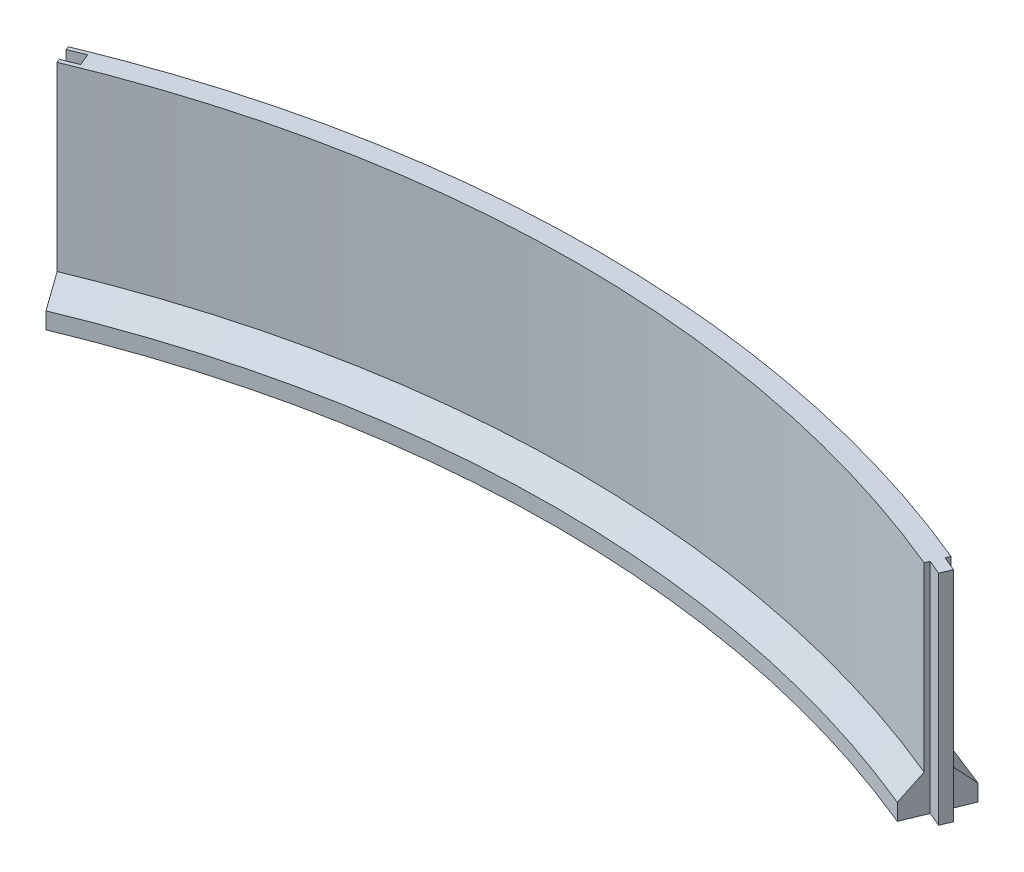
ISO-10303-21;
HEADER;
FILE_DESCRIPTION(('STEP AP214'),'2;1');
FILE_NAME('part.step','',(''),(''),'','','');
FILE_SCHEMA(('AUTOMOTIVE_DESIGN { 1 0 10303 214 1 1 1 1 }'));
ENDSEC;
DATA;
#1=APPLICATION_CONTEXT('core data for automotive mechanical design processes');
#2=APPLICATION_PROTOCOL_DEFINITION('international standard','automotive_design',2000,#1);
#3=PRODUCT_CONTEXT('',#1,'mechanical');
#4=PRODUCT('Part','Part','',(#3));
#5=PRODUCT_RELATED_PRODUCT_CATEGORY('part','',(#4));
#6=PRODUCT_DEFINITION_FORMATION('','',#4);
#7=PRODUCT_DEFINITION_CONTEXT('part definition',#1,'design');
#8=PRODUCT_DEFINITION('design','',#6,#7);
#9=PRODUCT_DEFINITION_SHAPE('','',#8);
#10=(LENGTH_UNIT() NAMED_UNIT(*) SI_UNIT(.MILLI.,.METRE.));
#11=(NAMED_UNIT(*) PLANE_ANGLE_UNIT() SI_UNIT($,.RADIAN.));
#12=(NAMED_UNIT(*) SI_UNIT($,.STERADIAN.) SOLID_ANGLE_UNIT());
#13=UNCERTAINTY_MEASURE_WITH_UNIT(LENGTH_MEASURE(1.E-05),#10,'distance_accuracy_value','');
#14=(GEOMETRIC_REPRESENTATION_CONTEXT(3) GLOBAL_UNCERTAINTY_ASSIGNED_CONTEXT((#13)) GLOBAL_UNIT_ASSIGNED_CONTEXT((#10,
#11,#12)) REPRESENTATION_CONTEXT('',''));
#15=CARTESIAN_POINT('',(0.,0.,0.));
#16=DIRECTION('',(0.,0.,1.));
#17=DIRECTION('',(1.,0.,0.));
#18=AXIS2_PLACEMENT_3D('',#15,#16,#17);
#19=CARTESIAN_POINT('',(0.,13.25,0.));
#20=DIRECTION('',(0.,-1.,0.));
#21=DIRECTION('',(0.,0.,-1.));
#22=AXIS2_PLACEMENT_3D('',#19,#20,#21);
#23=CYLINDRICAL_SURFACE('',#22,137.5);
#24=DIRECTION('',(0.,-1.,0.));
#25=VECTOR('',#24,1.);
#26=CARTESIAN_POINT('',(-52.6189719501999,13.25,-127.033435720302));
#27=LINE('',#26,#25);
#28=CARTESIAN_POINT('',(-52.6189719501999,13.25,-127.033435720302));
#29=VERTEX_POINT('',#28);
#30=CARTESIAN_POINT('',(-52.6189719501999,-8.75000000000001,-127.033435720302));
#31=VERTEX_POINT('',#30);
#32=EDGE_CURVE('E219',#29,#31,#27,.T.);
#33=ORIENTED_EDGE('',*,*,#32,.T.);
#34=CARTESIAN_POINT('',(0.,-8.75000000000001,0.));
#35=DIRECTION('',(0.,-1.,0.));
#36=DIRECTION('',(0.,0.,-1.));
#37=AXIS2_PLACEMENT_3D('',#34,#35,#36);
#38=CIRCLE('',#37,137.5);
#39=CARTESIAN_POINT('',(52.6189719502,-8.75000000000001,-127.033435720302));
#40=VERTEX_POINT('',#39);
#41=EDGE_CURVE('E157',#31,#40,#38,.T.);
#42=ORIENTED_EDGE('',*,*,#41,.T.);
#43=DIRECTION('',(0.,-1.,0.));
#44=VECTOR('',#43,1.);
#45=CARTESIAN_POINT('',(52.6189719502,13.25,-127.033435720302));
#46=LINE('',#45,#44);
#47=CARTESIAN_POINT('',(52.6189719502,13.25,-127.033435720302));
#48=VERTEX_POINT('',#47);
#49=EDGE_CURVE('E267',#48,#40,#46,.T.);
#50=ORIENTED_EDGE('',*,*,#49,.F.);
#51=CARTESIAN_POINT('',(0.,13.25,0.));
#52=DIRECTION('',(0.,-1.,0.));
#53=DIRECTION('',(0.,0.,1.));
#54=AXIS2_PLACEMENT_3D('',#51,#52,#53);
#55=CIRCLE('',#54,137.5);
#56=EDGE_CURVE('E194',#29,#48,#55,.T.);
#57=ORIENTED_EDGE('',*,*,#56,.F.);
#58=EDGE_LOOP('',(#33,#42,#50,#57));
#59=FACE_BOUND('',#58,.T.);
#60=ADVANCED_FACE('F37',(#59),#23,.F.);
#61=CARTESIAN_POINT('',(0.,13.25,0.));
#62=DIRECTION('',(0.,-1.,0.));
#63=DIRECTION('',(0.,0.,-1.));
#64=AXIS2_PLACEMENT_3D('',#61,#62,#63);
#65=CYLINDRICAL_SURFACE('',#64,140.);
#66=DIRECTION('',(0.,-1.,0.));
#67=VECTOR('',#66,1.);
#68=CARTESIAN_POINT('',(53.5756805311127,13.25,-129.34313455158));
#69=LINE('',#68,#67);
#70=CARTESIAN_POINT('',(53.5756805311127,13.25,-129.34313455158));
#71=VERTEX_POINT('',#70);
#72=CARTESIAN_POINT('',(53.5756805311127,-8.74999999999999,-129.34313455158));
#73=VERTEX_POINT('',#72);
#74=EDGE_CURVE('E257',#71,#73,#69,.T.);
#75=ORIENTED_EDGE('',*,*,#74,.T.);
#76=CARTESIAN_POINT('',(0.,-8.74999999999999,0.));
#77=DIRECTION('',(0.,-1.,0.));
#78=DIRECTION('',(0.,0.,-1.));
#79=AXIS2_PLACEMENT_3D('',#76,#77,#78);
#80=CIRCLE('',#79,140.);
#81=CARTESIAN_POINT('',(-53.5756805311127,-8.74999999999999,-129.34313455158));
#82=VERTEX_POINT('',#81);
#83=EDGE_CURVE('E59',#73,#82,#80,.F.);
#84=ORIENTED_EDGE('',*,*,#83,.T.);
#85=DIRECTION('',(0.,-1.,0.));
#86=VECTOR('',#85,1.);
#87=CARTESIAN_POINT('',(-53.5756805311127,13.25,-129.34313455158));
#88=LINE('',#87,#86);
#89=CARTESIAN_POINT('',(-53.5756805311127,13.25,-129.34313455158));
#90=VERTEX_POINT('',#89);
#91=EDGE_CURVE('E255',#90,#82,#88,.T.);
#92=ORIENTED_EDGE('',*,*,#91,.F.);
#93=CARTESIAN_POINT('',(0.,13.25,0.));
#94=DIRECTION('',(0.,1.,0.));
#95=DIRECTION('',(0.,0.,1.));
#96=AXIS2_PLACEMENT_3D('',#93,#94,#95);
#97=CIRCLE('',#96,140.);
#98=EDGE_CURVE('E207',#71,#90,#97,.T.);
#99=ORIENTED_EDGE('',*,*,#98,.F.);
#100=EDGE_LOOP('',(#75,#84,#92,#99));
#101=FACE_BOUND('',#100,.T.);
#102=ADVANCED_FACE('F312',(#101),#65,.T.);
#103=CARTESIAN_POINT('',(52.8338439991729,13.25,-127.552182735107));
#104=DIRECTION('',(-0.923879532510857,0.,-0.382683432366128));
#105=DIRECTION('',(-0.382683432366128,0.,0.923879532510857));
#106=AXIS2_PLACEMENT_3D('',#103,#104,#105);
#107=PLANE('',#106);
#108=DIRECTION('',(0.382683432366128,0.,-0.923879532510857));
#109=VECTOR('',#108,1.);
#110=CARTESIAN_POINT('',(52.8338439991729,-13.25,-127.552182735107));
#111=LINE('',#110,#109);
#112=CARTESIAN_POINT('',(51.6622633692874,-13.25,-124.723736889024));
#113=VERTEX_POINT('',#112);
#114=CARTESIAN_POINT('',(52.8338439991729,-13.25,-127.552182735107));
#115=VERTEX_POINT('',#114);
#116=EDGE_CURVE('E188',#113,#115,#111,.T.);
#117=ORIENTED_EDGE('',*,*,#116,.T.);
#118=DIRECTION('',(0.,-1.,0.));
#119=VECTOR('',#118,1.);
#120=CARTESIAN_POINT('',(52.8338439991729,13.25,-127.552182735107));
#121=LINE('',#120,#119);
#122=CARTESIAN_POINT('',(52.8338439991729,13.25,-127.552182735107));
#123=VERTEX_POINT('',#122);
#124=EDGE_CURVE('E265',#123,#115,#121,.T.);
#125=ORIENTED_EDGE('',*,*,#124,.F.);
#126=DIRECTION('',(0.382683432365087,0.,-0.923879532511288));
#127=VECTOR('',#126,1.);
#128=CARTESIAN_POINT('',(52.7955756559363,13.25,-127.459794781856));
#129=LINE('',#128,#127);
#130=EDGE_CURVE('E197',#48,#123,#129,.T.);
#131=ORIENTED_EDGE('',*,*,#130,.F.);
#132=ORIENTED_EDGE('',*,*,#49,.T.);
#133=DIRECTION('',(-0.270598050073833,-0.707106781186546,0.653281482437886));
#134=VECTOR('',#133,1.);
#135=CARTESIAN_POINT('',(-1.43125334104137E-10,-146.249999999999,-5.92844545053024E-11));
#136=LINE('',#135,#134);
#137=CARTESIAN_POINT('',(51.6622633692874,-11.25,-124.723736889024));
#138=VERTEX_POINT('',#137);
#139=EDGE_CURVE('E161',#40,#138,#136,.T.);
#140=ORIENTED_EDGE('',*,*,#139,.T.);
#141=DIRECTION('',(0.,-1.,0.));
#142=VECTOR('',#141,1.);
#143=CARTESIAN_POINT('',(51.6622633692874,-11.25,-124.723736889024));
#144=LINE('',#143,#142);
#145=EDGE_CURVE('E177',#138,#113,#144,.T.);
#146=ORIENTED_EDGE('',*,*,#145,.T.);
#147=EDGE_LOOP('',(#117,#125,#131,#132,#140,#146));
#148=FACE_BOUND('',#147,.T.);
#149=ADVANCED_FACE('F273',(#148),#107,.F.);
#150=CARTESIAN_POINT('',(54.5892151109444,13.25,-126.825084213613));
#151=DIRECTION('',(0.382683432365083,0.,-0.92387953251129));
#152=DIRECTION('',(-0.92387953251129,0.,-0.382683432365083));
#153=AXIS2_PLACEMENT_3D('',#150,#151,#152);
#154=PLANE('',#153);
#155=DIRECTION('',(0.92387953251129,0.,0.382683432365083));
#156=VECTOR('',#155,1.);
#157=CARTESIAN_POINT('',(54.5892151109444,-13.25,-126.825084213613));
#158=LINE('',#157,#156);
#159=CARTESIAN_POINT('',(54.5892151109444,-13.25,-126.825084213613));
#160=VERTEX_POINT('',#159);
#161=EDGE_CURVE('E222',#115,#160,#158,.T.);
#162=ORIENTED_EDGE('',*,*,#161,.T.);
#163=DIRECTION('',(0.,-1.,0.));
#164=VECTOR('',#163,1.);
#165=CARTESIAN_POINT('',(54.5892151109444,13.25,-126.825084213613));
#166=LINE('',#165,#164);
#167=CARTESIAN_POINT('',(54.5892151109444,13.25,-126.825084213613));
#168=VERTEX_POINT('',#167);
#169=EDGE_CURVE('E263',#168,#160,#166,.T.);
#170=ORIENTED_EDGE('',*,*,#169,.F.);
#171=DIRECTION('',(0.92387953251129,0.,0.382683432365083));
#172=VECTOR('',#171,1.);
#173=CARTESIAN_POINT('',(54.5892151109444,13.25,-126.825084213613));
#174=LINE('',#173,#172);
#175=EDGE_CURVE('E199',#123,#168,#174,.T.);
#176=ORIENTED_EDGE('',*,*,#175,.F.);
#177=ORIENTED_EDGE('',*,*,#124,.T.);
#178=EDGE_LOOP('',(#162,#170,#176,#177));
#179=FACE_BOUND('',#178,.T.);
#180=ADVANCED_FACE('F296',(#179),#154,.F.);
#181=CARTESIAN_POINT('',(55.1161795939115,13.25,-128.097289015281));
#182=DIRECTION('',(-0.923879532511286,0.,-0.382683432365091));
#183=DIRECTION('',(-0.382683432365091,0.,0.923879532511286));
#184=AXIS2_PLACEMENT_3D('',#181,#182,#183);
#185=PLANE('',#184);
#186=DIRECTION('',(0.382683432365091,0.,-0.923879532511286));
#187=VECTOR('',#186,1.);
#188=CARTESIAN_POINT('',(55.1161795939115,-13.25,-128.097289015281));
#189=LINE('',#188,#187);
#190=CARTESIAN_POINT('',(55.1161795939115,-13.25,-128.097289015281));
#191=VERTEX_POINT('',#190);
#192=EDGE_CURVE('E225',#160,#191,#189,.T.);
#193=ORIENTED_EDGE('',*,*,#192,.T.);
#194=DIRECTION('',(0.,-1.,0.));
#195=VECTOR('',#194,1.);
#196=CARTESIAN_POINT('',(55.1161795939115,13.25,-128.097289015281));
#197=LINE('',#196,#195);
#198=CARTESIAN_POINT('',(55.1161795939115,13.25,-128.097289015281));
#199=VERTEX_POINT('',#198);
#200=EDGE_CURVE('E261',#199,#191,#197,.T.);
#201=ORIENTED_EDGE('',*,*,#200,.F.);
#202=DIRECTION('',(0.382683432365091,0.,-0.923879532511286));
#203=VECTOR('',#202,1.);
#204=CARTESIAN_POINT('',(55.1161795939115,13.25,-128.097289015281));
#205=LINE('',#204,#203);
#206=EDGE_CURVE('E201',#168,#199,#205,.T.);
#207=ORIENTED_EDGE('',*,*,#206,.F.);
#208=ORIENTED_EDGE('',*,*,#169,.T.);
#209=EDGE_LOOP('',(#193,#201,#207,#208));
#210=FACE_BOUND('',#209,.T.);
#211=ADVANCED_FACE('F302',(#210),#185,.F.);
#212=CARTESIAN_POINT('',(53.36080848214,13.25,-128.824387536775));
#213=DIRECTION('',(-0.382683432365093,0.,0.923879532511286));
#214=DIRECTION('',(0.923879532511286,0.,0.382683432365093));
#215=AXIS2_PLACEMENT_3D('',#212,#213,#214);
#216=PLANE('',#215);
#217=DIRECTION('',(-0.923879532511286,0.,-0.382683432365092));
#218=VECTOR('',#217,1.);
#219=CARTESIAN_POINT('',(53.36080848214,-13.25,-128.824387536775));
#220=LINE('',#219,#218);
#221=CARTESIAN_POINT('',(53.36080848214,-13.25,-128.824387536775));
#222=VERTEX_POINT('',#221);
#223=EDGE_CURVE('E228',#191,#222,#220,.T.);
#224=ORIENTED_EDGE('',*,*,#223,.T.);
#225=DIRECTION('',(0.,-1.,0.));
#226=VECTOR('',#225,1.);
#227=CARTESIAN_POINT('',(53.36080848214,13.25,-128.824387536775));
#228=LINE('',#227,#226);
#229=CARTESIAN_POINT('',(53.36080848214,13.25,-128.824387536775));
#230=VERTEX_POINT('',#229);
#231=EDGE_CURVE('E259',#230,#222,#228,.T.);
#232=ORIENTED_EDGE('',*,*,#231,.F.);
#233=DIRECTION('',(-0.923879532511286,0.,-0.382683432365092));
#234=VECTOR('',#233,1.);
#235=CARTESIAN_POINT('',(53.36080848214,13.25,-128.824387536775));
#236=LINE('',#235,#234);
#237=EDGE_CURVE('E203',#199,#230,#236,.T.);
#238=ORIENTED_EDGE('',*,*,#237,.F.);
#239=ORIENTED_EDGE('',*,*,#200,.T.);
#240=EDGE_LOOP('',(#224,#232,#238,#239));
#241=FACE_BOUND('',#240,.T.);
#242=ADVANCED_FACE('F305',(#241),#216,.F.);
#243=CARTESIAN_POINT('',(53.5756805311127,13.25,-129.34313455158));
#244=DIRECTION('',(-0.923879532511279,0.,-0.382683432365109));
#245=DIRECTION('',(-0.382683432365109,0.,0.923879532511279));
#246=AXIS2_PLACEMENT_3D('',#243,#244,#245);
#247=PLANE('',#246);
#248=DIRECTION('',(0.382683432365109,0.,-0.923879532511279));
#249=VECTOR('',#248,1.);
#250=CARTESIAN_POINT('',(53.5756805311127,-13.25,-129.34313455158));
#251=LINE('',#250,#249);
#252=CARTESIAN_POINT('',(54.5323891120193,-13.25,-131.652833382858));
#253=VERTEX_POINT('',#252);
#254=EDGE_CURVE('E231',#222,#253,#251,.T.);
#255=ORIENTED_EDGE('',*,*,#254,.T.);
#256=DIRECTION('',(0.,-1.,0.));
#257=VECTOR('',#256,1.);
#258=CARTESIAN_POINT('',(54.5323891120193,-11.25,-131.652833382858));
#259=LINE('',#258,#257);
#260=CARTESIAN_POINT('',(54.5323891120193,-11.25,-131.652833382858));
#261=VERTEX_POINT('',#260);
#262=EDGE_CURVE('E189',#261,#253,#259,.T.);
#263=ORIENTED_EDGE('',*,*,#262,.F.);
#264=DIRECTION('',(0.270598050073111,-0.70710678118655,-0.653281482438181));
#265=VECTOR('',#264,1.);
#266=CARTESIAN_POINT('',(-2.53863801421052E-12,131.250000000001,-1.05153829544196E-12));
#267=LINE('',#266,#265);
#268=EDGE_CURVE('E46',#261,#73,#267,.F.);
#269=ORIENTED_EDGE('',*,*,#268,.T.);
#270=ORIENTED_EDGE('',*,*,#74,.F.);
#271=DIRECTION('',(0.382683432364266,0.,-0.923879532511628));
#272=VECTOR('',#271,1.);
#273=CARTESIAN_POINT('',(53.3990768253763,13.25,-128.916775490026));
#274=LINE('',#273,#272);
#275=EDGE_CURVE('E205',#230,#71,#274,.T.);
#276=ORIENTED_EDGE('',*,*,#275,.F.);
#277=ORIENTED_EDGE('',*,*,#231,.T.);
#278=EDGE_LOOP('',(#255,#263,#269,#270,#276,#277));
#279=FACE_BOUND('',#278,.T.);
#280=ADVANCED_FACE('F308',(#279),#247,.F.);
#281=CARTESIAN_POINT('',(-53.3990768253764,13.25,-128.916775490026));
#282=DIRECTION('',(0.923879532511318,0.,-0.382683432365014));
#283=DIRECTION('',(-0.382683432365014,0.,-0.923879532511318));
#284=AXIS2_PLACEMENT_3D('',#281,#282,#283);
#285=PLANE('',#284);
#286=DIRECTION('',(0.382683432365014,0.,0.923879532511318));
#287=VECTOR('',#286,1.);
#288=CARTESIAN_POINT('',(-53.3990768253764,-13.25,-128.916775490026));
#289=LINE('',#288,#287);
#290=CARTESIAN_POINT('',(-54.5323891120215,-13.25,-131.652833382858));
#291=VERTEX_POINT('',#290);
#292=CARTESIAN_POINT('',(-53.3990768253764,-13.25,-128.916775490026));
#293=VERTEX_POINT('',#292);
#294=EDGE_CURVE('E233',#291,#293,#289,.T.);
#295=ORIENTED_EDGE('',*,*,#294,.T.);
#296=DIRECTION('',(0.,-1.,0.));
#297=VECTOR('',#296,1.);
#298=CARTESIAN_POINT('',(-53.3990768253764,13.25,-128.916775490026));
#299=LINE('',#298,#297);
#300=CARTESIAN_POINT('',(-53.3990768253764,13.25,-128.916775490026));
#301=VERTEX_POINT('',#300);
#302=EDGE_CURVE('E253',#301,#293,#299,.T.);
#303=ORIENTED_EDGE('',*,*,#302,.F.);
#304=DIRECTION('',(0.382683432365014,0.,0.923879532511318));
#305=VECTOR('',#304,1.);
#306=CARTESIAN_POINT('',(-53.3990768253764,13.25,-128.916775490026));
#307=LINE('',#306,#305);
#308=EDGE_CURVE('E209',#90,#301,#307,.T.);
#309=ORIENTED_EDGE('',*,*,#308,.F.);
#310=ORIENTED_EDGE('',*,*,#91,.T.);
#311=DIRECTION('',(0.270598050073044,0.70710678118655,0.653281482438209));
#312=VECTOR('',#311,1.);
#313=CARTESIAN_POINT('',(-1.06994617316099E-11,131.250000000001,4.43186215932373E-12));
#314=LINE('',#313,#312);
#315=CARTESIAN_POINT('',(-54.5323891120215,-11.25,-131.652833382858));
#316=VERTEX_POINT('',#315);
#317=EDGE_CURVE('E11',#82,#316,#314,.F.);
#318=ORIENTED_EDGE('',*,*,#317,.T.);
#319=DIRECTION('',(0.,-1.,0.));
#320=VECTOR('',#319,1.);
#321=CARTESIAN_POINT('',(-54.5323891120215,-11.25,-131.652833382858));
#322=LINE('',#321,#320);
#323=EDGE_CURVE('E171',#316,#291,#322,.T.);
#324=ORIENTED_EDGE('',*,*,#323,.T.);
#325=EDGE_LOOP('',(#295,#303,#309,#310,#318,#324));
#326=FACE_BOUND('',#325,.T.);
#327=ADVANCED_FACE('F315',(#326),#285,.F.);
#328=CARTESIAN_POINT('',(-53.3990768253764,13.25,-128.916775490026));
#329=DIRECTION('',(-0.382683432365069,0.,-0.923879532511295));
#330=DIRECTION('',(-0.923879532511295,0.,0.382683432365069));
#331=AXIS2_PLACEMENT_3D('',#328,#329,#330);
#332=PLANE('',#331);
#333=DIRECTION('',(0.923879532511295,0.,-0.382683432365069));
#334=VECTOR('',#333,1.);
#335=CARTESIAN_POINT('',(-53.3990768253764,-13.25,-128.916775490026));
#336=LINE('',#335,#334);
#337=CARTESIAN_POINT('',(-51.5513177603538,-13.25,-129.682142354756));
#338=VERTEX_POINT('',#337);
#339=EDGE_CURVE('E236',#293,#338,#336,.T.);
#340=ORIENTED_EDGE('',*,*,#339,.T.);
#341=DIRECTION('',(0.,-1.,0.));
#342=VECTOR('',#341,1.);
#343=CARTESIAN_POINT('',(-51.5513177603538,13.25,-129.682142354756));
#344=LINE('',#343,#342);
#345=CARTESIAN_POINT('',(-51.5513177603538,13.25,-129.682142354756));
#346=VERTEX_POINT('',#345);
#347=EDGE_CURVE('E251',#346,#338,#344,.T.);
#348=ORIENTED_EDGE('',*,*,#347,.F.);
#349=DIRECTION('',(0.923879532511295,0.,-0.382683432365069));
#350=VECTOR('',#349,1.);
#351=CARTESIAN_POINT('',(-53.3990768253764,13.25,-128.916775490026));
#352=LINE('',#351,#350);
#353=EDGE_CURVE('E211',#301,#346,#352,.T.);
#354=ORIENTED_EDGE('',*,*,#353,.F.);
#355=ORIENTED_EDGE('',*,*,#302,.T.);
#356=EDGE_LOOP('',(#340,#348,#354,#355));
#357=FACE_BOUND('',#356,.T.);
#358=ADVANCED_FACE('F320',(#357),#332,.F.);
#359=CARTESIAN_POINT('',(-51.5513177603538,13.25,-129.682142354756));
#360=DIRECTION('',(0.923879532511284,0.,-0.382683432365097));
#361=DIRECTION('',(-0.382683432365097,0.,-0.923879532511284));
#362=AXIS2_PLACEMENT_3D('',#359,#360,#361);
#363=PLANE('',#362);
#364=DIRECTION('',(0.382683432365097,0.,0.923879532511284));
#365=VECTOR('',#364,1.);
#366=CARTESIAN_POINT('',(-51.5513177603538,-13.25,-129.682142354756));
#367=LINE('',#366,#365);
#368=CARTESIAN_POINT('',(-50.9478165909137,-13.25,-128.225161646586));
#369=VERTEX_POINT('',#368);
#370=EDGE_CURVE('E239',#338,#369,#367,.T.);
#371=ORIENTED_EDGE('',*,*,#370,.T.);
#372=DIRECTION('',(0.,-1.,0.));
#373=VECTOR('',#372,1.);
#374=CARTESIAN_POINT('',(-50.9478165909137,13.25,-128.225161646586));
#375=LINE('',#374,#373);
#376=CARTESIAN_POINT('',(-50.9478165909137,13.25,-128.225161646586));
#377=VERTEX_POINT('',#376);
#378=EDGE_CURVE('E249',#377,#369,#375,.T.);
#379=ORIENTED_EDGE('',*,*,#378,.F.);
#380=DIRECTION('',(0.382683432365097,0.,0.923879532511284));
#381=VECTOR('',#380,1.);
#382=CARTESIAN_POINT('',(-51.5513177603538,13.25,-129.682142354756));
#383=LINE('',#382,#381);
#384=EDGE_CURVE('E213',#346,#377,#383,.T.);
#385=ORIENTED_EDGE('',*,*,#384,.F.);
#386=ORIENTED_EDGE('',*,*,#347,.T.);
#387=EDGE_LOOP('',(#371,#379,#385,#386));
#388=FACE_BOUND('',#387,.T.);
#389=ADVANCED_FACE('F322',(#388),#363,.F.);
#390=CARTESIAN_POINT('',(-50.9478165909137,13.25,-128.225161646586));
#391=DIRECTION('',(0.382683432365118,0.,0.923879532511275));
#392=DIRECTION('',(0.923879532511275,0.,-0.382683432365118));
#393=AXIS2_PLACEMENT_3D('',#390,#391,#392);
#394=PLANE('',#393);
#395=DIRECTION('',(-0.923879532511275,0.,0.382683432365118));
#396=VECTOR('',#395,1.);
#397=CARTESIAN_POINT('',(-50.9478165909137,-13.25,-128.225161646586));
#398=LINE('',#397,#396);
#399=CARTESIAN_POINT('',(-52.7955756559363,-13.25,-127.459794781856));
#400=VERTEX_POINT('',#399);
#401=EDGE_CURVE('E242',#369,#400,#398,.T.);
#402=ORIENTED_EDGE('',*,*,#401,.T.);
#403=DIRECTION('',(0.,-1.,0.));
#404=VECTOR('',#403,1.);
#405=CARTESIAN_POINT('',(-52.7955756559363,13.25,-127.459794781856));
#406=LINE('',#405,#404);
#407=CARTESIAN_POINT('',(-52.7955756559363,13.25,-127.459794781856));
#408=VERTEX_POINT('',#407);
#409=EDGE_CURVE('E247',#408,#400,#406,.T.);
#410=ORIENTED_EDGE('',*,*,#409,.F.);
#411=DIRECTION('',(-0.923879532511275,0.,0.382683432365118));
#412=VECTOR('',#411,1.);
#413=CARTESIAN_POINT('',(-50.9478165909137,13.25,-128.225161646586));
#414=LINE('',#413,#412);
#415=EDGE_CURVE('E215',#377,#408,#414,.T.);
#416=ORIENTED_EDGE('',*,*,#415,.F.);
#417=ORIENTED_EDGE('',*,*,#378,.T.);
#418=EDGE_LOOP('',(#402,#410,#416,#417));
#419=FACE_BOUND('',#418,.T.);
#420=ADVANCED_FACE('F286',(#419),#394,.F.);
#421=CARTESIAN_POINT('',(-52.6189719501999,13.25,-127.033435720302));
#422=DIRECTION('',(0.923879532511283,0.,-0.3826834323651));
#423=DIRECTION('',(-0.3826834323651,0.,-0.923879532511283));
#424=AXIS2_PLACEMENT_3D('',#421,#422,#423);
#425=PLANE('',#424);
#426=DIRECTION('',(0.3826834323651,0.,0.923879532511283));
#427=VECTOR('',#426,1.);
#428=CARTESIAN_POINT('',(-52.6189719501999,-13.25,-127.033435720302));
#429=LINE('',#428,#427);
#430=CARTESIAN_POINT('',(-51.6622633692886,-13.25,-124.723736889024));
#431=VERTEX_POINT('',#430);
#432=EDGE_CURVE('E167',#400,#431,#429,.T.);
#433=ORIENTED_EDGE('',*,*,#432,.T.);
#434=DIRECTION('',(0.,-1.,0.));
#435=VECTOR('',#434,1.);
#436=CARTESIAN_POINT('',(-51.6622633692886,-11.25,-124.723736889024));
#437=LINE('',#436,#435);
#438=CARTESIAN_POINT('',(-51.6622633692886,-11.25,-124.723736889024));
#439=VERTEX_POINT('',#438);
#440=EDGE_CURVE('E164',#439,#431,#437,.T.);
#441=ORIENTED_EDGE('',*,*,#440,.F.);
#442=DIRECTION('',(-0.270598050073106,0.707106781186545,-0.653281482438187));
#443=VECTOR('',#442,1.);
#444=CARTESIAN_POINT('',(1.250086900937E-12,-146.249999999999,-5.17802948513074E-13));
#445=LINE('',#444,#443);
#446=EDGE_CURVE('E151',#439,#31,#445,.T.);
#447=ORIENTED_EDGE('',*,*,#446,.T.);
#448=ORIENTED_EDGE('',*,*,#32,.F.);
#449=DIRECTION('',(0.3826834323651,0.,0.923879532511283));
#450=VECTOR('',#449,1.);
#451=CARTESIAN_POINT('',(-52.6189719501999,13.25,-127.033435720302));
#452=LINE('',#451,#450);
#453=EDGE_CURVE('E217',#408,#29,#452,.T.);
#454=ORIENTED_EDGE('',*,*,#453,.F.);
#455=ORIENTED_EDGE('',*,*,#409,.T.);
#456=EDGE_LOOP('',(#433,#441,#447,#448,#454,#455));
#457=FACE_BOUND('',#456,.T.);
#458=ADVANCED_FACE('F165',(#457),#425,.F.);
#459=CARTESIAN_POINT('',(0.,13.25,0.));
#460=DIRECTION('',(0.,1.,0.));
#461=DIRECTION('',(0.,0.,1.));
#462=AXIS2_PLACEMENT_3D('',#459,#460,#461);
#463=PLANE('',#462);
#464=ORIENTED_EDGE('',*,*,#56,.T.);
#465=ORIENTED_EDGE('',*,*,#130,.T.);
#466=ORIENTED_EDGE('',*,*,#175,.T.);
#467=ORIENTED_EDGE('',*,*,#206,.T.);
#468=ORIENTED_EDGE('',*,*,#237,.T.);
#469=ORIENTED_EDGE('',*,*,#275,.T.);
#470=ORIENTED_EDGE('',*,*,#98,.T.);
#471=ORIENTED_EDGE('',*,*,#308,.T.);
#472=ORIENTED_EDGE('',*,*,#353,.T.);
#473=ORIENTED_EDGE('',*,*,#384,.T.);
#474=ORIENTED_EDGE('',*,*,#415,.T.);
#475=ORIENTED_EDGE('',*,*,#453,.T.);
#476=EDGE_LOOP('',(#464,#465,#466,#467,#468,#469,#470,#471,#472,#473,#474,#475));
#477=FACE_BOUND('',#476,.T.);
#478=ADVANCED_FACE('F281',(#477),#463,.T.);
#479=CARTESIAN_POINT('',(0.,-13.25,0.));
#480=DIRECTION('',(0.,1.,0.));
#481=DIRECTION('',(0.,0.,1.));
#482=AXIS2_PLACEMENT_3D('',#479,#480,#481);
#483=PLANE('',#482);
#484=ORIENTED_EDGE('',*,*,#116,.F.);
#485=CARTESIAN_POINT('',(0.,-13.25,0.));
#486=DIRECTION('',(0.,-1.,0.));
#487=DIRECTION('',(0.,0.,-1.));
#488=AXIS2_PLACEMENT_3D('',#485,#486,#487);
#489=CIRCLE('',#488,135.);
#490=EDGE_CURVE('E183',#431,#113,#489,.T.);
#491=ORIENTED_EDGE('',*,*,#490,.F.);
#492=ORIENTED_EDGE('',*,*,#432,.F.);
#493=ORIENTED_EDGE('',*,*,#401,.F.);
#494=ORIENTED_EDGE('',*,*,#370,.F.);
#495=ORIENTED_EDGE('',*,*,#339,.F.);
#496=ORIENTED_EDGE('',*,*,#294,.F.);
#497=CARTESIAN_POINT('',(0.,-13.25,0.));
#498=DIRECTION('',(0.,-1.,0.));
#499=DIRECTION('',(0.,0.,-1.));
#500=AXIS2_PLACEMENT_3D('',#497,#498,#499);
#501=CIRCLE('',#500,142.5);
#502=EDGE_CURVE('E178',#291,#253,#501,.T.);
#503=ORIENTED_EDGE('',*,*,#502,.T.);
#504=ORIENTED_EDGE('',*,*,#254,.F.);
#505=ORIENTED_EDGE('',*,*,#223,.F.);
#506=ORIENTED_EDGE('',*,*,#192,.F.);
#507=ORIENTED_EDGE('',*,*,#161,.F.);
#508=EDGE_LOOP('',(#484,#491,#492,#493,#494,#495,#496,#503,#504,#505,#506,#507));
#509=FACE_BOUND('',#508,.T.);
#510=ADVANCED_FACE('F290',(#509),#483,.F.);
#511=CARTESIAN_POINT('',(0.,-11.25,0.));
#512=DIRECTION('',(0.,-1.,0.));
#513=DIRECTION('',(0.,0.,-1.));
#514=AXIS2_PLACEMENT_3D('',#511,#512,#513);
#515=CYLINDRICAL_SURFACE('',#514,142.5);
#516=ORIENTED_EDGE('',*,*,#502,.F.);
#517=ORIENTED_EDGE('',*,*,#323,.F.);
#518=CARTESIAN_POINT('',(0.,-11.25,0.));
#519=DIRECTION('',(0.,-1.,0.));
#520=DIRECTION('',(0.,0.,-1.));
#521=AXIS2_PLACEMENT_3D('',#518,#519,#520);
#522=CIRCLE('',#521,142.5);
#523=EDGE_CURVE('E172',#316,#261,#522,.T.);
#524=ORIENTED_EDGE('',*,*,#523,.T.);
#525=ORIENTED_EDGE('',*,*,#262,.T.);
#526=EDGE_LOOP('',(#516,#517,#524,#525));
#527=FACE_BOUND('',#526,.T.);
#528=ADVANCED_FACE('F327',(#527),#515,.T.);
#529=CARTESIAN_POINT('',(0.,-11.25,0.));
#530=DIRECTION('',(0.,-1.,0.));
#531=DIRECTION('',(0.,0.,-1.));
#532=AXIS2_PLACEMENT_3D('',#529,#530,#531);
#533=CYLINDRICAL_SURFACE('',#532,135.);
#534=ORIENTED_EDGE('',*,*,#490,.T.);
#535=ORIENTED_EDGE('',*,*,#145,.F.);
#536=CARTESIAN_POINT('',(0.,-11.25,0.));
#537=DIRECTION('',(0.,-1.,0.));
#538=DIRECTION('',(0.,0.,-1.));
#539=AXIS2_PLACEMENT_3D('',#536,#537,#538);
#540=CIRCLE('',#539,135.);
#541=EDGE_CURVE('E156',#439,#138,#540,.T.);
#542=ORIENTED_EDGE('',*,*,#541,.F.);
#543=ORIENTED_EDGE('',*,*,#440,.T.);
#544=EDGE_LOOP('',(#534,#535,#542,#543));
#545=FACE_BOUND('',#544,.T.);
#546=ADVANCED_FACE('F175',(#545),#533,.F.);
#547=CARTESIAN_POINT('',(0.,-11.25,0.));
#548=DIRECTION('',(0.,1.,0.));
#549=DIRECTION('',(0.,0.,1.));
#550=AXIS2_PLACEMENT_3D('',#547,#548,#549);
#551=CONICAL_SURFACE('',#550,135.,0.785398163397451);
#552=ORIENTED_EDGE('',*,*,#139,.F.);
#553=ORIENTED_EDGE('',*,*,#41,.F.);
#554=ORIENTED_EDGE('',*,*,#446,.F.);
#555=ORIENTED_EDGE('',*,*,#541,.T.);
#556=EDGE_LOOP('',(#552,#553,#554,#555));
#557=FACE_BOUND('',#556,.T.);
#558=ADVANCED_FACE('F154',(#557),#551,.F.);
#559=CARTESIAN_POINT('',(0.,-11.25,0.));
#560=DIRECTION('',(0.,-1.,0.));
#561=DIRECTION('',(0.,0.,-1.));
#562=AXIS2_PLACEMENT_3D('',#559,#560,#561);
#563=CONICAL_SURFACE('',#562,142.5,0.785398163397446);
#564=ORIENTED_EDGE('',*,*,#317,.F.);
#565=ORIENTED_EDGE('',*,*,#83,.F.);
#566=ORIENTED_EDGE('',*,*,#268,.F.);
#567=ORIENTED_EDGE('',*,*,#523,.F.);
#568=EDGE_LOOP('',(#564,#565,#566,#567));
#569=FACE_BOUND('',#568,.T.);
#570=ADVANCED_FACE('F40',(#569),#563,.T.);
#571=CLOSED_SHELL('',(#60,#102,#149,#180,#211,#242,#280,#327,#358,#389,#420,#458,#478,#510,#528,
#546,#558,#570));
#572=MANIFOLD_SOLID_BREP('B2',#571);
#573=ADVANCED_BREP_SHAPE_REPRESENTATION('',(#18,#572),#14);
#574=SHAPE_DEFINITION_REPRESENTATION(#9,#573);
ENDSEC;
END-ISO-10303-21;
